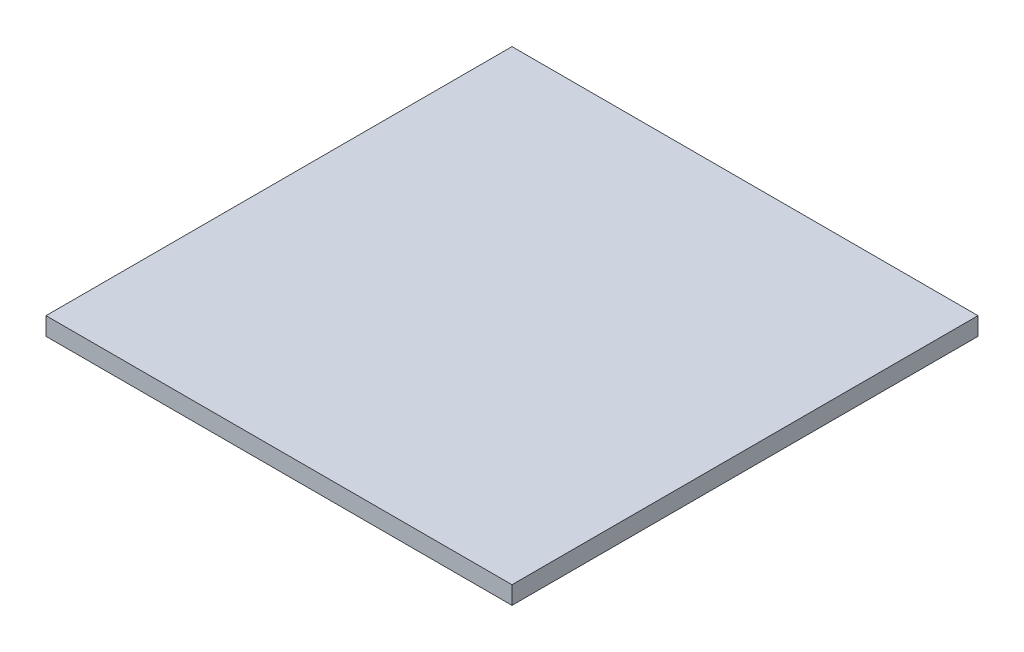
ISO-10303-21;
HEADER;
FILE_DESCRIPTION(('STEP AP214'),'2;1');
FILE_NAME('part.step','',(''),(''),'','','');
FILE_SCHEMA(('AUTOMOTIVE_DESIGN { 1 0 10303 214 1 1 1 1 }'));
ENDSEC;
DATA;
#1=APPLICATION_CONTEXT('core data for automotive mechanical design processes');
#2=APPLICATION_PROTOCOL_DEFINITION('international standard','automotive_design',2000,#1);
#3=PRODUCT_CONTEXT('',#1,'mechanical');
#4=PRODUCT('Part','Part','',(#3));
#5=PRODUCT_RELATED_PRODUCT_CATEGORY('part','',(#4));
#6=PRODUCT_DEFINITION_FORMATION('','',#4);
#7=PRODUCT_DEFINITION_CONTEXT('part definition',#1,'design');
#8=PRODUCT_DEFINITION('design','',#6,#7);
#9=PRODUCT_DEFINITION_SHAPE('','',#8);
#10=(LENGTH_UNIT() NAMED_UNIT(*) SI_UNIT(.MILLI.,.METRE.));
#11=(NAMED_UNIT(*) PLANE_ANGLE_UNIT() SI_UNIT($,.RADIAN.));
#12=(NAMED_UNIT(*) SI_UNIT($,.STERADIAN.) SOLID_ANGLE_UNIT());
#13=UNCERTAINTY_MEASURE_WITH_UNIT(LENGTH_MEASURE(1.E-05),#10,'distance_accuracy_value','');
#14=(GEOMETRIC_REPRESENTATION_CONTEXT(3) GLOBAL_UNCERTAINTY_ASSIGNED_CONTEXT((#13)) GLOBAL_UNIT_ASSIGNED_CONTEXT((#10,
#11,#12)) REPRESENTATION_CONTEXT('',''));
#15=CARTESIAN_POINT('',(0.,0.,0.));
#16=DIRECTION('',(0.,0.,1.));
#17=DIRECTION('',(1.,0.,0.));
#18=AXIS2_PLACEMENT_3D('',#15,#16,#17);
#19=CARTESIAN_POINT('',(82.5,6.35,82.5));
#20=DIRECTION('',(-1.,0.,0.));
#21=DIRECTION('',(0.,0.,1.));
#22=AXIS2_PLACEMENT_3D('',#19,#20,#21);
#23=PLANE('',#22);
#24=DIRECTION('',(0.,0.,-1.));
#25=VECTOR('',#24,1.);
#26=CARTESIAN_POINT('',(82.5,0.,82.5));
#27=LINE('',#26,#25);
#28=CARTESIAN_POINT('',(82.5,0.,82.5));
#29=VERTEX_POINT('',#28);
#30=CARTESIAN_POINT('',(82.5,0.,-82.5));
#31=VERTEX_POINT('',#30);
#32=EDGE_CURVE('E96',#29,#31,#27,.T.);
#33=ORIENTED_EDGE('',*,*,#32,.T.);
#34=DIRECTION('',(0.,-1.,0.));
#35=VECTOR('',#34,1.);
#36=CARTESIAN_POINT('',(82.5,6.35,-82.5));
#37=LINE('',#36,#35);
#38=CARTESIAN_POINT('',(82.5,6.35,-82.5));
#39=VERTEX_POINT('',#38);
#40=EDGE_CURVE('E11',#39,#31,#37,.T.);
#41=ORIENTED_EDGE('',*,*,#40,.F.);
#42=DIRECTION('',(0.,0.,-1.));
#43=VECTOR('',#42,1.);
#44=CARTESIAN_POINT('',(82.5,6.35,82.5));
#45=LINE('',#44,#43);
#46=CARTESIAN_POINT('',(82.5,6.35,82.5));
#47=VERTEX_POINT('',#46);
#48=EDGE_CURVE('E84',#47,#39,#45,.T.);
#49=ORIENTED_EDGE('',*,*,#48,.F.);
#50=DIRECTION('',(0.,-1.,0.));
#51=VECTOR('',#50,1.);
#52=CARTESIAN_POINT('',(82.5,6.35,82.5));
#53=LINE('',#52,#51);
#54=EDGE_CURVE('E92',#47,#29,#53,.T.);
#55=ORIENTED_EDGE('',*,*,#54,.T.);
#56=EDGE_LOOP('',(#33,#41,#49,#55));
#57=FACE_BOUND('',#56,.T.);
#58=ADVANCED_FACE('F33',(#57),#23,.F.);
#59=CARTESIAN_POINT('',(-82.5,6.35,-82.5));
#60=DIRECTION('',(0.,0.,1.));
#61=DIRECTION('',(1.,0.,0.));
#62=AXIS2_PLACEMENT_3D('',#59,#60,#61);
#63=PLANE('',#62);
#64=DIRECTION('',(-1.,0.,0.));
#65=VECTOR('',#64,1.);
#66=CARTESIAN_POINT('',(-82.5,0.,-82.5));
#67=LINE('',#66,#65);
#68=CARTESIAN_POINT('',(-82.5,0.,-82.5));
#69=VERTEX_POINT('',#68);
#70=EDGE_CURVE('E88',#31,#69,#67,.T.);
#71=ORIENTED_EDGE('',*,*,#70,.T.);
#72=DIRECTION('',(0.,-1.,0.));
#73=VECTOR('',#72,1.);
#74=CARTESIAN_POINT('',(-82.5,6.35,-82.5));
#75=LINE('',#74,#73);
#76=CARTESIAN_POINT('',(-82.5,6.35,-82.5));
#77=VERTEX_POINT('',#76);
#78=EDGE_CURVE('E41',#77,#69,#75,.T.);
#79=ORIENTED_EDGE('',*,*,#78,.F.);
#80=DIRECTION('',(-1.,0.,0.));
#81=VECTOR('',#80,1.);
#82=CARTESIAN_POINT('',(-82.5,6.35,-82.5));
#83=LINE('',#82,#81);
#84=EDGE_CURVE('E79',#39,#77,#83,.T.);
#85=ORIENTED_EDGE('',*,*,#84,.F.);
#86=ORIENTED_EDGE('',*,*,#40,.T.);
#87=EDGE_LOOP('',(#71,#79,#85,#86));
#88=FACE_BOUND('',#87,.T.);
#89=ADVANCED_FACE('F87',(#88),#63,.F.);
#90=CARTESIAN_POINT('',(-82.5,6.35,82.5));
#91=DIRECTION('',(1.,0.,0.));
#92=DIRECTION('',(0.,0.,-1.));
#93=AXIS2_PLACEMENT_3D('',#90,#91,#92);
#94=PLANE('',#93);
#95=DIRECTION('',(0.,0.,1.));
#96=VECTOR('',#95,1.);
#97=CARTESIAN_POINT('',(-82.5,0.,82.5));
#98=LINE('',#97,#96);
#99=CARTESIAN_POINT('',(-82.5,0.,82.5));
#100=VERTEX_POINT('',#99);
#101=EDGE_CURVE('E66',#69,#100,#98,.T.);
#102=ORIENTED_EDGE('',*,*,#101,.T.);
#103=DIRECTION('',(0.,-1.,0.));
#104=VECTOR('',#103,1.);
#105=CARTESIAN_POINT('',(-82.5,6.35,82.5));
#106=LINE('',#105,#104);
#107=CARTESIAN_POINT('',(-82.5,6.35,82.5));
#108=VERTEX_POINT('',#107);
#109=EDGE_CURVE('E89',#108,#100,#106,.T.);
#110=ORIENTED_EDGE('',*,*,#109,.F.);
#111=DIRECTION('',(0.,0.,1.));
#112=VECTOR('',#111,1.);
#113=CARTESIAN_POINT('',(-82.5,6.35,82.5));
#114=LINE('',#113,#112);
#115=EDGE_CURVE('E82',#77,#108,#114,.T.);
#116=ORIENTED_EDGE('',*,*,#115,.F.);
#117=ORIENTED_EDGE('',*,*,#78,.T.);
#118=EDGE_LOOP('',(#102,#110,#116,#117));
#119=FACE_BOUND('',#118,.T.);
#120=ADVANCED_FACE('F90',(#119),#94,.F.);
#121=CARTESIAN_POINT('',(-82.5,6.35,82.5));
#122=DIRECTION('',(0.,0.,-1.));
#123=DIRECTION('',(-1.,0.,0.));
#124=AXIS2_PLACEMENT_3D('',#121,#122,#123);
#125=PLANE('',#124);
#126=DIRECTION('',(1.,0.,0.));
#127=VECTOR('',#126,1.);
#128=CARTESIAN_POINT('',(-82.5,0.,82.5));
#129=LINE('',#128,#127);
#130=EDGE_CURVE('E72',#100,#29,#129,.T.);
#131=ORIENTED_EDGE('',*,*,#130,.T.);
#132=ORIENTED_EDGE('',*,*,#54,.F.);
#133=DIRECTION('',(1.,0.,0.));
#134=VECTOR('',#133,1.);
#135=CARTESIAN_POINT('',(-82.5,6.35,82.5));
#136=LINE('',#135,#134);
#137=EDGE_CURVE('E49',#108,#47,#136,.T.);
#138=ORIENTED_EDGE('',*,*,#137,.F.);
#139=ORIENTED_EDGE('',*,*,#109,.T.);
#140=EDGE_LOOP('',(#131,#132,#138,#139));
#141=FACE_BOUND('',#140,.T.);
#142=ADVANCED_FACE('F103',(#141),#125,.F.);
#143=CARTESIAN_POINT('',(0.,6.35,0.));
#144=DIRECTION('',(0.,-1.,0.));
#145=DIRECTION('',(0.,0.,-1.));
#146=AXIS2_PLACEMENT_3D('',#143,#144,#145);
#147=PLANE('',#146);
#148=ORIENTED_EDGE('',*,*,#48,.T.);
#149=ORIENTED_EDGE('',*,*,#84,.T.);
#150=ORIENTED_EDGE('',*,*,#115,.T.);
#151=ORIENTED_EDGE('',*,*,#137,.T.);
#152=EDGE_LOOP('',(#148,#149,#150,#151));
#153=FACE_BOUND('',#152,.T.);
#154=ADVANCED_FACE('F80',(#153),#147,.F.);
#155=CARTESIAN_POINT('',(0.,0.,0.));
#156=DIRECTION('',(0.,-1.,0.));
#157=DIRECTION('',(0.,0.,-1.));
#158=AXIS2_PLACEMENT_3D('',#155,#156,#157);
#159=PLANE('',#158);
#160=ORIENTED_EDGE('',*,*,#32,.F.);
#161=ORIENTED_EDGE('',*,*,#130,.F.);
#162=ORIENTED_EDGE('',*,*,#101,.F.);
#163=ORIENTED_EDGE('',*,*,#70,.F.);
#164=EDGE_LOOP('',(#160,#161,#162,#163));
#165=FACE_BOUND('',#164,.T.);
#166=ADVANCED_FACE('F106',(#165),#159,.T.);
#167=CLOSED_SHELL('',(#58,#89,#120,#142,#154,#166));
#168=MANIFOLD_SOLID_BREP('B2',#167);
#169=ADVANCED_BREP_SHAPE_REPRESENTATION('',(#18,#168),#14);
#170=SHAPE_DEFINITION_REPRESENTATION(#9,#169);
ENDSEC;
END-ISO-10303-21;
